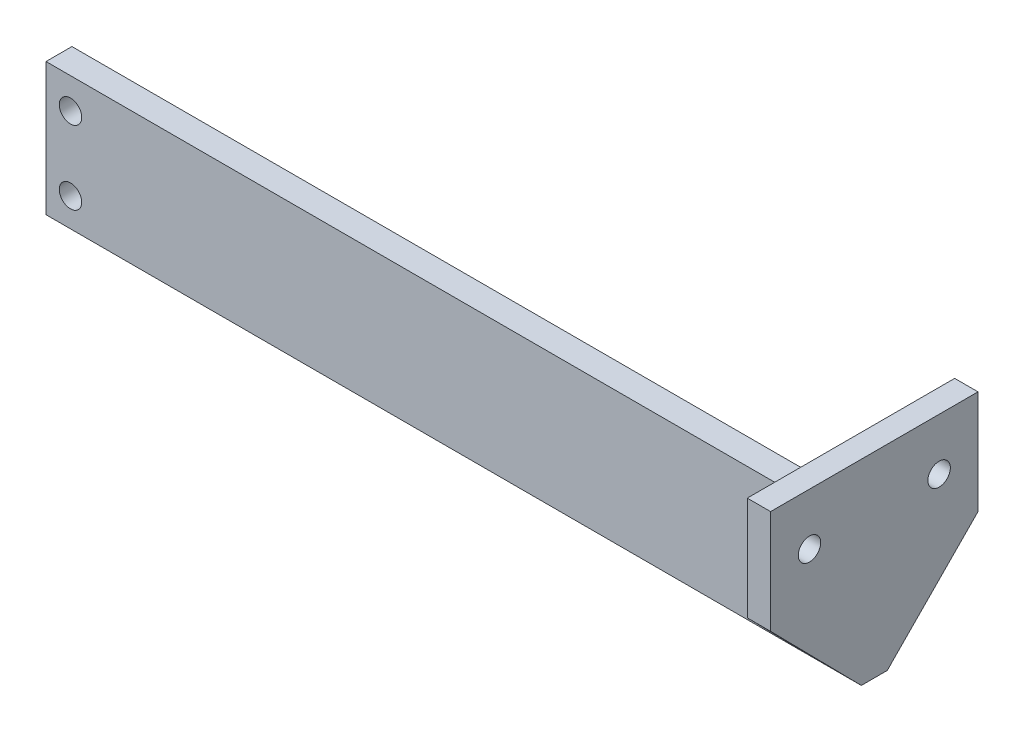
ISO-10303-21;
HEADER;
FILE_DESCRIPTION(('STEP AP214'),'2;1');
FILE_NAME('part.step','',(''),(''),'','','');
FILE_SCHEMA(('AUTOMOTIVE_DESIGN { 1 0 10303 214 1 1 1 1 }'));
ENDSEC;
DATA;
#1=APPLICATION_CONTEXT('core data for automotive mechanical design processes');
#2=APPLICATION_PROTOCOL_DEFINITION('international standard','automotive_design',2000,#1);
#3=PRODUCT_CONTEXT('',#1,'mechanical');
#4=PRODUCT('Part','Part','',(#3));
#5=PRODUCT_RELATED_PRODUCT_CATEGORY('part','',(#4));
#6=PRODUCT_DEFINITION_FORMATION('','',#4);
#7=PRODUCT_DEFINITION_CONTEXT('part definition',#1,'design');
#8=PRODUCT_DEFINITION('design','',#6,#7);
#9=PRODUCT_DEFINITION_SHAPE('','',#8);
#10=(LENGTH_UNIT() NAMED_UNIT(*) SI_UNIT(.MILLI.,.METRE.));
#11=(NAMED_UNIT(*) PLANE_ANGLE_UNIT() SI_UNIT($,.RADIAN.));
#12=(NAMED_UNIT(*) SI_UNIT($,.STERADIAN.) SOLID_ANGLE_UNIT());
#13=UNCERTAINTY_MEASURE_WITH_UNIT(LENGTH_MEASURE(1.E-05),#10,'distance_accuracy_value','');
#14=(GEOMETRIC_REPRESENTATION_CONTEXT(3) GLOBAL_UNCERTAINTY_ASSIGNED_CONTEXT((#13)) GLOBAL_UNIT_ASSIGNED_CONTEXT((#10,
#11,#12)) REPRESENTATION_CONTEXT('',''));
#15=CARTESIAN_POINT('',(0.,0.,0.));
#16=DIRECTION('',(0.,0.,1.));
#17=DIRECTION('',(1.,0.,0.));
#18=AXIS2_PLACEMENT_3D('',#15,#16,#17);
#19=CARTESIAN_POINT('',(0.,0.,6.35));
#20=DIRECTION('',(1.,0.,0.));
#21=DIRECTION('',(0.,0.,-1.));
#22=AXIS2_PLACEMENT_3D('',#19,#20,#21);
#23=PLANE('',#22);
#24=DIRECTION('',(0.,-1.,0.));
#25=VECTOR('',#24,1.);
#26=CARTESIAN_POINT('',(0.,0.,0.));
#27=LINE('',#26,#25);
#28=CARTESIAN_POINT('',(0.,32.5,0.));
#29=VERTEX_POINT('',#28);
#30=CARTESIAN_POINT('',(0.,0.,0.));
#31=VERTEX_POINT('',#30);
#32=EDGE_CURVE('E114',#29,#31,#27,.T.);
#33=ORIENTED_EDGE('',*,*,#32,.T.);
#34=DIRECTION('',(0.,0.,-1.));
#35=VECTOR('',#34,1.);
#36=CARTESIAN_POINT('',(0.,0.,6.35));
#37=LINE('',#36,#35);
#38=CARTESIAN_POINT('',(0.,0.,6.35));
#39=VERTEX_POINT('',#38);
#40=EDGE_CURVE('E11',#39,#31,#37,.T.);
#41=ORIENTED_EDGE('',*,*,#40,.F.);
#42=DIRECTION('',(0.,-1.,0.));
#43=VECTOR('',#42,1.);
#44=CARTESIAN_POINT('',(0.,0.,6.35));
#45=LINE('',#44,#43);
#46=CARTESIAN_POINT('',(0.,32.5,6.35));
#47=VERTEX_POINT('',#46);
#48=EDGE_CURVE('E105',#47,#39,#45,.T.);
#49=ORIENTED_EDGE('',*,*,#48,.F.);
#50=DIRECTION('',(0.,0.,-1.));
#51=VECTOR('',#50,1.);
#52=CARTESIAN_POINT('',(0.,32.5,6.35));
#53=LINE('',#52,#51);
#54=EDGE_CURVE('E115',#47,#29,#53,.T.);
#55=ORIENTED_EDGE('',*,*,#54,.T.);
#56=EDGE_LOOP('',(#33,#41,#49,#55));
#57=FACE_BOUND('',#56,.T.);
#58=ADVANCED_FACE('F46',(#57),#23,.F.);
#59=CARTESIAN_POINT('',(0.,0.,6.35));
#60=DIRECTION('',(0.,1.,0.));
#61=DIRECTION('',(0.,0.,1.));
#62=AXIS2_PLACEMENT_3D('',#59,#60,#61);
#63=PLANE('',#62);
#64=DIRECTION('',(1.,0.,0.));
#65=VECTOR('',#64,1.);
#66=CARTESIAN_POINT('',(0.,0.,0.));
#67=LINE('',#66,#65);
#68=CARTESIAN_POINT('',(193.9764,0.,0.));
#69=VERTEX_POINT('',#68);
#70=EDGE_CURVE('E76',#31,#69,#67,.T.);
#71=ORIENTED_EDGE('',*,*,#70,.T.);
#72=DIRECTION('',(-1.,0.,0.));
#73=VECTOR('',#72,1.);
#74=CARTESIAN_POINT('',(199.6914,0.,0.));
#75=LINE('',#74,#73);
#76=CARTESIAN_POINT('',(199.6914,0.,0.));
#77=VERTEX_POINT('',#76);
#78=EDGE_CURVE('E145',#77,#69,#75,.T.);
#79=ORIENTED_EDGE('',*,*,#78,.F.);
#80=DIRECTION('',(0.,0.,-1.));
#81=VECTOR('',#80,1.);
#82=CARTESIAN_POINT('',(199.6914,0.,0.));
#83=LINE('',#82,#81);
#84=CARTESIAN_POINT('',(199.6914,0.,6.35));
#85=VERTEX_POINT('',#84);
#86=EDGE_CURVE('E211',#85,#77,#83,.T.);
#87=ORIENTED_EDGE('',*,*,#86,.F.);
#88=DIRECTION('',(-1.,0.,0.));
#89=VECTOR('',#88,1.);
#90=CARTESIAN_POINT('',(199.6914,0.,6.35));
#91=LINE('',#90,#89);
#92=CARTESIAN_POINT('',(193.9764,0.,6.35));
#93=VERTEX_POINT('',#92);
#94=EDGE_CURVE('E102',#85,#93,#91,.T.);
#95=ORIENTED_EDGE('',*,*,#94,.T.);
#96=DIRECTION('',(1.,0.,0.));
#97=VECTOR('',#96,1.);
#98=CARTESIAN_POINT('',(0.,0.,6.35));
#99=LINE('',#98,#97);
#100=EDGE_CURVE('E95',#39,#93,#99,.T.);
#101=ORIENTED_EDGE('',*,*,#100,.F.);
#102=ORIENTED_EDGE('',*,*,#40,.T.);
#103=EDGE_LOOP('',(#71,#79,#87,#95,#101,#102));
#104=FACE_BOUND('',#103,.T.);
#105=ADVANCED_FACE('F96',(#104),#63,.F.);
#106=CARTESIAN_POINT('',(0.,32.5,6.35));
#107=DIRECTION('',(0.,-1.,0.));
#108=DIRECTION('',(0.,0.,-1.));
#109=AXIS2_PLACEMENT_3D('',#106,#107,#108);
#110=PLANE('',#109);
#111=DIRECTION('',(-1.,0.,0.));
#112=VECTOR('',#111,1.);
#113=CARTESIAN_POINT('',(0.,32.5,0.));
#114=LINE('',#113,#112);
#115=CARTESIAN_POINT('',(193.9764,32.5,0.));
#116=VERTEX_POINT('',#115);
#117=EDGE_CURVE('E112',#116,#29,#114,.T.);
#118=ORIENTED_EDGE('',*,*,#117,.T.);
#119=ORIENTED_EDGE('',*,*,#54,.F.);
#120=DIRECTION('',(-1.,0.,0.));
#121=VECTOR('',#120,1.);
#122=CARTESIAN_POINT('',(0.,32.5,6.35));
#123=LINE('',#122,#121);
#124=CARTESIAN_POINT('',(193.9764,32.5,6.35));
#125=VERTEX_POINT('',#124);
#126=EDGE_CURVE('E63',#125,#47,#123,.T.);
#127=ORIENTED_EDGE('',*,*,#126,.F.);
#128=DIRECTION('',(0.,0.,-1.));
#129=VECTOR('',#128,1.);
#130=CARTESIAN_POINT('',(193.9764,32.5,6.35));
#131=LINE('',#130,#129);
#132=EDGE_CURVE('E55',#125,#116,#131,.T.);
#133=ORIENTED_EDGE('',*,*,#132,.T.);
#134=EDGE_LOOP('',(#118,#119,#127,#133));
#135=FACE_BOUND('',#134,.T.);
#136=ADVANCED_FACE('F136',(#135),#110,.F.);
#137=CARTESIAN_POINT('',(0.,0.,6.35));
#138=DIRECTION('',(0.,0.,-1.));
#139=DIRECTION('',(-1.,0.,0.));
#140=AXIS2_PLACEMENT_3D('',#137,#138,#139);
#141=PLANE('',#140);
#142=CARTESIAN_POINT('',(6.,25.,6.35));
#143=DIRECTION('',(0.,0.,1.));
#144=DIRECTION('',(1.,0.,0.));
#145=AXIS2_PLACEMENT_3D('',#142,#143,#144);
#146=CIRCLE('',#145,2.75);
#147=CARTESIAN_POINT('',(8.75,25.,6.35));
#148=VERTEX_POINT('',#147);
#149=EDGE_CURVE('E124',#148,#148,#146,.T.);
#150=ORIENTED_EDGE('',*,*,#149,.F.);
#151=EDGE_LOOP('',(#150));
#152=FACE_BOUND('',#151,.T.);
#153=CARTESIAN_POINT('',(6.,7.,6.35));
#154=DIRECTION('',(0.,0.,1.));
#155=DIRECTION('',(1.,0.,0.));
#156=AXIS2_PLACEMENT_3D('',#153,#154,#155);
#157=CIRCLE('',#156,2.75);
#158=CARTESIAN_POINT('',(8.75,7.,6.35));
#159=VERTEX_POINT('',#158);
#160=EDGE_CURVE('E245',#159,#159,#157,.T.);
#161=ORIENTED_EDGE('',*,*,#160,.F.);
#162=EDGE_LOOP('',(#161));
#163=FACE_BOUND('',#162,.T.);
#164=ORIENTED_EDGE('',*,*,#48,.T.);
#165=ORIENTED_EDGE('',*,*,#100,.T.);
#166=DIRECTION('',(0.,1.,0.));
#167=VECTOR('',#166,1.);
#168=CARTESIAN_POINT('',(193.9764,0.,6.35));
#169=LINE('',#168,#167);
#170=EDGE_CURVE('E104',#93,#125,#169,.T.);
#171=ORIENTED_EDGE('',*,*,#170,.T.);
#172=ORIENTED_EDGE('',*,*,#126,.T.);
#173=EDGE_LOOP('',(#164,#165,#171,#172));
#174=FACE_BOUND('',#173,.T.);
#175=ADVANCED_FACE('F108',(#152,#163,#174),#141,.F.);
#176=CARTESIAN_POINT('',(0.,0.,0.));
#177=DIRECTION('',(0.,0.,-1.));
#178=DIRECTION('',(-1.,0.,0.));
#179=AXIS2_PLACEMENT_3D('',#176,#177,#178);
#180=PLANE('',#179);
#181=CARTESIAN_POINT('',(6.,25.,0.));
#182=DIRECTION('',(0.,0.,1.));
#183=DIRECTION('',(1.,0.,0.));
#184=AXIS2_PLACEMENT_3D('',#181,#182,#183);
#185=CIRCLE('',#184,2.75);
#186=CARTESIAN_POINT('',(8.75,25.,0.));
#187=VERTEX_POINT('',#186);
#188=EDGE_CURVE('E118',#187,#187,#185,.T.);
#189=ORIENTED_EDGE('',*,*,#188,.T.);
#190=EDGE_LOOP('',(#189));
#191=FACE_BOUND('',#190,.T.);
#192=CARTESIAN_POINT('',(6.,7.,0.));
#193=DIRECTION('',(0.,0.,1.));
#194=DIRECTION('',(1.,0.,0.));
#195=AXIS2_PLACEMENT_3D('',#192,#193,#194);
#196=CIRCLE('',#195,2.75);
#197=CARTESIAN_POINT('',(8.75,7.,0.));
#198=VERTEX_POINT('',#197);
#199=EDGE_CURVE('E240',#198,#198,#196,.T.);
#200=ORIENTED_EDGE('',*,*,#199,.T.);
#201=EDGE_LOOP('',(#200));
#202=FACE_BOUND('',#201,.T.);
#203=ORIENTED_EDGE('',*,*,#32,.F.);
#204=ORIENTED_EDGE('',*,*,#117,.F.);
#205=DIRECTION('',(0.,1.,0.));
#206=VECTOR('',#205,1.);
#207=CARTESIAN_POINT('',(193.9764,0.,0.));
#208=LINE('',#207,#206);
#209=EDGE_CURVE('E83',#69,#116,#208,.T.);
#210=ORIENTED_EDGE('',*,*,#209,.F.);
#211=ORIENTED_EDGE('',*,*,#70,.F.);
#212=EDGE_LOOP('',(#203,#204,#210,#211));
#213=FACE_BOUND('',#212,.T.);
#214=ADVANCED_FACE('F138',(#191,#202,#213),#180,.T.);
#215=CARTESIAN_POINT('',(6.,7.,0.));
#216=DIRECTION('',(0.,0.,1.));
#217=DIRECTION('',(1.,0.,0.));
#218=AXIS2_PLACEMENT_3D('',#215,#216,#217);
#219=CYLINDRICAL_SURFACE('',#218,2.75);
#220=ORIENTED_EDGE('',*,*,#199,.F.);
#221=EDGE_LOOP('',(#220));
#222=FACE_BOUND('',#221,.T.);
#223=ORIENTED_EDGE('',*,*,#160,.T.);
#224=EDGE_LOOP('',(#223));
#225=FACE_BOUND('',#224,.T.);
#226=ADVANCED_FACE('F256',(#222,#225),#219,.F.);
#227=CARTESIAN_POINT('',(6.,25.,0.));
#228=DIRECTION('',(0.,0.,1.));
#229=DIRECTION('',(1.,0.,0.));
#230=AXIS2_PLACEMENT_3D('',#227,#228,#229);
#231=CYLINDRICAL_SURFACE('',#230,2.75);
#232=ORIENTED_EDGE('',*,*,#188,.F.);
#233=EDGE_LOOP('',(#232));
#234=FACE_BOUND('',#233,.T.);
#235=ORIENTED_EDGE('',*,*,#149,.T.);
#236=EDGE_LOOP('',(#235));
#237=FACE_BOUND('',#236,.T.);
#238=ADVANCED_FACE('F259',(#234,#237),#231,.F.);
#239=CARTESIAN_POINT('',(193.9764,0.,0.));
#240=DIRECTION('',(1.,0.,0.));
#241=DIRECTION('',(0.,0.,-1.));
#242=AXIS2_PLACEMENT_3D('',#239,#240,#241);
#243=PLANE('',#242);
#244=CARTESIAN_POINT('',(193.9764,35.294,19.05));
#245=DIRECTION('',(1.,0.,0.));
#246=DIRECTION('',(0.,0.,-1.));
#247=AXIS2_PLACEMENT_3D('',#244,#245,#246);
#248=CIRCLE('',#247,2.75);
#249=CARTESIAN_POINT('',(193.9764,35.294,16.3));
#250=VERTEX_POINT('',#249);
#251=EDGE_CURVE('E217',#250,#250,#248,.T.);
#252=ORIENTED_EDGE('',*,*,#251,.T.);
#253=EDGE_LOOP('',(#252));
#254=FACE_BOUND('',#253,.T.);
#255=CARTESIAN_POINT('',(193.9764,35.294,-12.7));
#256=DIRECTION('',(1.,0.,0.));
#257=DIRECTION('',(0.,0.,-1.));
#258=AXIS2_PLACEMENT_3D('',#255,#256,#257);
#259=CIRCLE('',#258,2.75);
#260=CARTESIAN_POINT('',(193.9764,35.294,-15.45));
#261=VERTEX_POINT('',#260);
#262=EDGE_CURVE('E447',#261,#261,#259,.T.);
#263=ORIENTED_EDGE('',*,*,#262,.T.);
#264=EDGE_LOOP('',(#263));
#265=FACE_BOUND('',#264,.T.);
#266=DIRECTION('',(0.,-0.712904311519134,0.701261322630466));
#267=VECTOR('',#266,1.);
#268=CARTESIAN_POINT('',(193.9764,0.,0.));
#269=LINE('',#268,#267);
#270=CARTESIAN_POINT('',(193.9764,22.594,-22.225));
#271=VERTEX_POINT('',#270);
#272=EDGE_CURVE('E214',#271,#69,#269,.T.);
#273=ORIENTED_EDGE('',*,*,#272,.T.);
#274=ORIENTED_EDGE('',*,*,#209,.T.);
#275=ORIENTED_EDGE('',*,*,#132,.F.);
#276=ORIENTED_EDGE('',*,*,#170,.F.);
#277=DIRECTION('',(0.,-0.712904311519134,-0.701261322630466));
#278=VECTOR('',#277,1.);
#279=CARTESIAN_POINT('',(193.9764,-3.17456959957092,3.22727673937932));
#280=LINE('',#279,#278);
#281=CARTESIAN_POINT('',(193.9764,22.594,28.575));
#282=VERTEX_POINT('',#281);
#283=EDGE_CURVE('E227',#282,#93,#280,.T.);
#284=ORIENTED_EDGE('',*,*,#283,.F.);
#285=DIRECTION('',(0.,1.,0.));
#286=VECTOR('',#285,1.);
#287=CARTESIAN_POINT('',(193.9764,0.,28.575));
#288=LINE('',#287,#286);
#289=CARTESIAN_POINT('',(193.9764,47.994,28.575));
#290=VERTEX_POINT('',#289);
#291=EDGE_CURVE('E223',#282,#290,#288,.T.);
#292=ORIENTED_EDGE('',*,*,#291,.T.);
#293=DIRECTION('',(0.,0.,-1.));
#294=VECTOR('',#293,1.);
#295=CARTESIAN_POINT('',(193.9764,47.994,0.));
#296=LINE('',#295,#294);
#297=CARTESIAN_POINT('',(193.9764,47.994,-22.225));
#298=VERTEX_POINT('',#297);
#299=EDGE_CURVE('E220',#290,#298,#296,.T.);
#300=ORIENTED_EDGE('',*,*,#299,.T.);
#301=DIRECTION('',(0.,1.,0.));
#302=VECTOR('',#301,1.);
#303=CARTESIAN_POINT('',(193.9764,0.,-22.225));
#304=LINE('',#303,#302);
#305=EDGE_CURVE('E192',#271,#298,#304,.T.);
#306=ORIENTED_EDGE('',*,*,#305,.F.);
#307=EDGE_LOOP('',(#273,#274,#275,#276,#284,#292,#300,#306));
#308=FACE_BOUND('',#307,.T.);
#309=ADVANCED_FACE('F317',(#254,#265,#308),#243,.F.);
#310=CARTESIAN_POINT('',(199.6914,0.,0.));
#311=DIRECTION('',(0.,-0.701261322630466,-0.712904311519134));
#312=DIRECTION('',(0.,0.712904311519134,-0.701261322630466));
#313=AXIS2_PLACEMENT_3D('',#310,#311,#312);
#314=PLANE('',#313);
#315=ORIENTED_EDGE('',*,*,#272,.F.);
#316=DIRECTION('',(-1.,0.,0.));
#317=VECTOR('',#316,1.);
#318=CARTESIAN_POINT('',(199.6914,22.594,-22.225));
#319=LINE('',#318,#317);
#320=CARTESIAN_POINT('',(199.6914,22.594,-22.225));
#321=VERTEX_POINT('',#320);
#322=EDGE_CURVE('E197',#321,#271,#319,.T.);
#323=ORIENTED_EDGE('',*,*,#322,.F.);
#324=DIRECTION('',(0.,-0.712904311519134,0.701261322630466));
#325=VECTOR('',#324,1.);
#326=CARTESIAN_POINT('',(199.6914,0.,0.));
#327=LINE('',#326,#325);
#328=EDGE_CURVE('E184',#321,#77,#327,.T.);
#329=ORIENTED_EDGE('',*,*,#328,.T.);
#330=ORIENTED_EDGE('',*,*,#78,.T.);
#331=EDGE_LOOP('',(#315,#323,#329,#330));
#332=FACE_BOUND('',#331,.T.);
#333=ADVANCED_FACE('F327',(#332),#314,.T.);
#334=CARTESIAN_POINT('',(199.6914,0.,-22.225));
#335=DIRECTION('',(0.,0.,1.));
#336=DIRECTION('',(1.,0.,0.));
#337=AXIS2_PLACEMENT_3D('',#334,#335,#336);
#338=PLANE('',#337);
#339=ORIENTED_EDGE('',*,*,#305,.T.);
#340=DIRECTION('',(-1.,0.,0.));
#341=VECTOR('',#340,1.);
#342=CARTESIAN_POINT('',(199.6914,47.994,-22.225));
#343=LINE('',#342,#341);
#344=CARTESIAN_POINT('',(199.6914,47.994,-22.225));
#345=VERTEX_POINT('',#344);
#346=EDGE_CURVE('E189',#345,#298,#343,.T.);
#347=ORIENTED_EDGE('',*,*,#346,.F.);
#348=DIRECTION('',(0.,1.,0.));
#349=VECTOR('',#348,1.);
#350=CARTESIAN_POINT('',(199.6914,0.,-22.225));
#351=LINE('',#350,#349);
#352=EDGE_CURVE('E177',#321,#345,#351,.T.);
#353=ORIENTED_EDGE('',*,*,#352,.F.);
#354=ORIENTED_EDGE('',*,*,#322,.T.);
#355=EDGE_LOOP('',(#339,#347,#353,#354));
#356=FACE_BOUND('',#355,.T.);
#357=ADVANCED_FACE('F190',(#356),#338,.F.);
#358=CARTESIAN_POINT('',(199.6914,47.994,0.));
#359=DIRECTION('',(0.,1.,0.));
#360=DIRECTION('',(0.,0.,1.));
#361=AXIS2_PLACEMENT_3D('',#358,#359,#360);
#362=PLANE('',#361);
#363=ORIENTED_EDGE('',*,*,#299,.F.);
#364=DIRECTION('',(-1.,0.,0.));
#365=VECTOR('',#364,1.);
#366=CARTESIAN_POINT('',(199.6914,47.994,28.575));
#367=LINE('',#366,#365);
#368=CARTESIAN_POINT('',(199.6914,47.994,28.575));
#369=VERTEX_POINT('',#368);
#370=EDGE_CURVE('E198',#369,#290,#367,.T.);
#371=ORIENTED_EDGE('',*,*,#370,.F.);
#372=DIRECTION('',(0.,0.,-1.));
#373=VECTOR('',#372,1.);
#374=CARTESIAN_POINT('',(199.6914,47.994,0.));
#375=LINE('',#374,#373);
#376=EDGE_CURVE('E182',#369,#345,#375,.T.);
#377=ORIENTED_EDGE('',*,*,#376,.T.);
#378=ORIENTED_EDGE('',*,*,#346,.T.);
#379=EDGE_LOOP('',(#363,#371,#377,#378));
#380=FACE_BOUND('',#379,.T.);
#381=ADVANCED_FACE('F200',(#380),#362,.T.);
#382=CARTESIAN_POINT('',(199.6914,0.,28.575));
#383=DIRECTION('',(0.,0.,1.));
#384=DIRECTION('',(1.,0.,0.));
#385=AXIS2_PLACEMENT_3D('',#382,#383,#384);
#386=PLANE('',#385);
#387=ORIENTED_EDGE('',*,*,#291,.F.);
#388=DIRECTION('',(-1.,0.,0.));
#389=VECTOR('',#388,1.);
#390=CARTESIAN_POINT('',(199.6914,22.594,28.575));
#391=LINE('',#390,#389);
#392=CARTESIAN_POINT('',(199.6914,22.594,28.575));
#393=VERTEX_POINT('',#392);
#394=EDGE_CURVE('E234',#393,#282,#391,.T.);
#395=ORIENTED_EDGE('',*,*,#394,.F.);
#396=DIRECTION('',(0.,1.,0.));
#397=VECTOR('',#396,1.);
#398=CARTESIAN_POINT('',(199.6914,0.,28.575));
#399=LINE('',#398,#397);
#400=EDGE_CURVE('E202',#393,#369,#399,.T.);
#401=ORIENTED_EDGE('',*,*,#400,.T.);
#402=ORIENTED_EDGE('',*,*,#370,.T.);
#403=EDGE_LOOP('',(#387,#395,#401,#402));
#404=FACE_BOUND('',#403,.T.);
#405=ADVANCED_FACE('F352',(#404),#386,.T.);
#406=CARTESIAN_POINT('',(199.6914,-3.17456959957092,3.22727673937932));
#407=DIRECTION('',(0.,0.701261322630466,-0.712904311519134));
#408=DIRECTION('',(0.,0.712904311519134,0.701261322630466));
#409=AXIS2_PLACEMENT_3D('',#406,#407,#408);
#410=PLANE('',#409);
#411=ORIENTED_EDGE('',*,*,#283,.T.);
#412=ORIENTED_EDGE('',*,*,#94,.F.);
#413=DIRECTION('',(0.,-0.712904311519134,-0.701261322630466));
#414=VECTOR('',#413,1.);
#415=CARTESIAN_POINT('',(199.6914,-3.17456959957092,3.22727673937932));
#416=LINE('',#415,#414);
#417=EDGE_CURVE('E205',#393,#85,#416,.T.);
#418=ORIENTED_EDGE('',*,*,#417,.F.);
#419=ORIENTED_EDGE('',*,*,#394,.T.);
#420=EDGE_LOOP('',(#411,#412,#418,#419));
#421=FACE_BOUND('',#420,.T.);
#422=ADVANCED_FACE('F360',(#421),#410,.F.);
#423=CARTESIAN_POINT('',(199.6914,0.,0.));
#424=DIRECTION('',(1.,0.,0.));
#425=DIRECTION('',(0.,0.,-1.));
#426=AXIS2_PLACEMENT_3D('',#423,#424,#425);
#427=PLANE('',#426);
#428=CARTESIAN_POINT('',(199.6914,35.294,19.05));
#429=DIRECTION('',(1.,0.,0.));
#430=DIRECTION('',(0.,0.,-1.));
#431=AXIS2_PLACEMENT_3D('',#428,#429,#430);
#432=CIRCLE('',#431,2.75);
#433=CARTESIAN_POINT('',(199.6914,35.294,16.3));
#434=VERTEX_POINT('',#433);
#435=EDGE_CURVE('E443',#434,#434,#432,.T.);
#436=ORIENTED_EDGE('',*,*,#435,.F.);
#437=EDGE_LOOP('',(#436));
#438=FACE_BOUND('',#437,.T.);
#439=CARTESIAN_POINT('',(199.6914,35.294,-12.7));
#440=DIRECTION('',(1.,0.,0.));
#441=DIRECTION('',(0.,0.,-1.));
#442=AXIS2_PLACEMENT_3D('',#439,#440,#441);
#443=CIRCLE('',#442,2.75);
#444=CARTESIAN_POINT('',(199.6914,35.294,-15.45));
#445=VERTEX_POINT('',#444);
#446=EDGE_CURVE('E456',#445,#445,#443,.T.);
#447=ORIENTED_EDGE('',*,*,#446,.F.);
#448=EDGE_LOOP('',(#447));
#449=FACE_BOUND('',#448,.T.);
#450=ORIENTED_EDGE('',*,*,#328,.F.);
#451=ORIENTED_EDGE('',*,*,#352,.T.);
#452=ORIENTED_EDGE('',*,*,#376,.F.);
#453=ORIENTED_EDGE('',*,*,#400,.F.);
#454=ORIENTED_EDGE('',*,*,#417,.T.);
#455=ORIENTED_EDGE('',*,*,#86,.T.);
#456=EDGE_LOOP('',(#450,#451,#452,#453,#454,#455));
#457=FACE_BOUND('',#456,.T.);
#458=ADVANCED_FACE('F179',(#438,#449,#457),#427,.T.);
#459=CARTESIAN_POINT('',(0.,35.294,-12.7));
#460=DIRECTION('',(1.,0.,0.));
#461=DIRECTION('',(0.,0.,-1.));
#462=AXIS2_PLACEMENT_3D('',#459,#460,#461);
#463=CYLINDRICAL_SURFACE('',#462,2.75);
#464=CARTESIAN_POINT('',(199.6914,35.294,-15.45));
#465=CARTESIAN_POINT('',(199.63186875,35.294,-15.45));
#466=CARTESIAN_POINT('',(199.5723375,35.294,-15.45));
#467=CARTESIAN_POINT('',(199.453275,35.294,-15.45));
#468=CARTESIAN_POINT('',(199.39374375,35.294,-15.45));
#469=CARTESIAN_POINT('',(199.27468125,35.294,-15.45));
#470=CARTESIAN_POINT('',(199.21515,35.294,-15.45));
#471=CARTESIAN_POINT('',(199.0960875,35.294,-15.45));
#472=CARTESIAN_POINT('',(199.03655625,35.294,-15.45));
#473=CARTESIAN_POINT('',(198.91749375,35.294,-15.45));
#474=CARTESIAN_POINT('',(198.8579625,35.294,-15.45));
#475=CARTESIAN_POINT('',(198.7389,35.294,-15.45));
#476=CARTESIAN_POINT('',(198.67936875,35.294,-15.45));
#477=CARTESIAN_POINT('',(198.56030625,35.294,-15.45));
#478=CARTESIAN_POINT('',(198.500775,35.294,-15.45));
#479=CARTESIAN_POINT('',(198.3817125,35.294,-15.45));
#480=CARTESIAN_POINT('',(198.32218125,35.294,-15.45));
#481=CARTESIAN_POINT('',(198.20311875,35.294,-15.45));
#482=CARTESIAN_POINT('',(198.1435875,35.294,-15.45));
#483=CARTESIAN_POINT('',(198.024525,35.294,-15.45));
#484=CARTESIAN_POINT('',(197.96499375,35.294,-15.45));
#485=CARTESIAN_POINT('',(197.84593125,35.294,-15.45));
#486=CARTESIAN_POINT('',(197.7864,35.294,-15.45));
#487=CARTESIAN_POINT('',(197.6673375,35.294,-15.45));
#488=CARTESIAN_POINT('',(197.60780625,35.294,-15.45));
#489=CARTESIAN_POINT('',(197.48874375,35.294,-15.45));
#490=CARTESIAN_POINT('',(197.4292125,35.294,-15.45));
#491=CARTESIAN_POINT('',(197.31015,35.294,-15.45));
#492=CARTESIAN_POINT('',(197.25061875,35.294,-15.45));
#493=CARTESIAN_POINT('',(197.13155625,35.294,-15.45));
#494=CARTESIAN_POINT('',(197.072025,35.294,-15.45));
#495=CARTESIAN_POINT('',(196.9529625,35.294,-15.45));
#496=CARTESIAN_POINT('',(196.89343125,35.294,-15.45));
#497=CARTESIAN_POINT('',(196.77436875,35.294,-15.45));
#498=CARTESIAN_POINT('',(196.7148375,35.294,-15.45));
#499=CARTESIAN_POINT('',(196.595775,35.294,-15.45));
#500=CARTESIAN_POINT('',(196.53624375,35.294,-15.45));
#501=CARTESIAN_POINT('',(196.41718125,35.294,-15.45));
#502=CARTESIAN_POINT('',(196.35765,35.294,-15.45));
#503=CARTESIAN_POINT('',(196.2385875,35.294,-15.45));
#504=CARTESIAN_POINT('',(196.17905625,35.294,-15.45));
#505=CARTESIAN_POINT('',(196.05999375,35.294,-15.45));
#506=CARTESIAN_POINT('',(196.0004625,35.294,-15.45));
#507=CARTESIAN_POINT('',(195.8814,35.294,-15.45));
#508=CARTESIAN_POINT('',(195.82186875,35.294,-15.45));
#509=CARTESIAN_POINT('',(195.70280625,35.294,-15.45));
#510=CARTESIAN_POINT('',(195.643275,35.294,-15.45));
#511=CARTESIAN_POINT('',(195.5242125,35.294,-15.45));
#512=CARTESIAN_POINT('',(195.46468125,35.294,-15.45));
#513=CARTESIAN_POINT('',(195.34561875,35.294,-15.45));
#514=CARTESIAN_POINT('',(195.2860875,35.294,-15.45));
#515=CARTESIAN_POINT('',(195.167025,35.294,-15.45));
#516=CARTESIAN_POINT('',(195.10749375,35.294,-15.45));
#517=CARTESIAN_POINT('',(194.98843125,35.294,-15.45));
#518=CARTESIAN_POINT('',(194.9289,35.294,-15.45));
#519=CARTESIAN_POINT('',(194.8098375,35.294,-15.45));
#520=CARTESIAN_POINT('',(194.75030625,35.294,-15.45));
#521=CARTESIAN_POINT('',(194.63124375,35.294,-15.45));
#522=CARTESIAN_POINT('',(194.5717125,35.294,-15.45));
#523=CARTESIAN_POINT('',(194.45265,35.294,-15.45));
#524=CARTESIAN_POINT('',(194.39311875,35.294,-15.45));
#525=CARTESIAN_POINT('',(194.27405625,35.294,-15.45));
#526=CARTESIAN_POINT('',(194.214525,35.294,-15.45));
#527=CARTESIAN_POINT('',(194.0954625,35.294,-15.45));
#528=CARTESIAN_POINT('',(194.03593125,35.294,-15.45));
#529=CARTESIAN_POINT('',(193.9764,35.294,-15.45));
#530=B_SPLINE_CURVE_WITH_KNOTS('',3,(#464,#465,#466,#467,#468,#469,#470,#471,#472,#473,#474,
#475,#476,#477,#478,#479,#480,#481,#482,#483,#484,#485,#486,#487,#488,#489,#490,#491,#492,#493,
#494,#495,#496,#497,#498,#499,#500,#501,#502,#503,#504,#505,#506,#507,#508,#509,#510,#511,#512,
#513,#514,#515,#516,#517,#518,#519,#520,#521,#522,#523,#524,#525,#526,#527,#528,#529),
.UNSPECIFIED.,.F.,.F.,(4,2,2,2,2,2,2,2,2,2,2,2,2,2,2,2,2,2,2,2,2,2,2,2,2,2,2,2,2,2,2,2,4),(0.,
0.178593750000011,0.357187499999995,0.535781250000006,0.714374999999989,0.892968750000001,
1.07156250000001,1.25015625,1.42875000000001,1.60734375000002,1.7859375,1.96453125000001,
2.14312500000002,2.32171875000001,2.50031250000002,2.67890625,2.85750000000001,3.03609375000002,
3.21468750000001,3.39328125000002,3.571875,3.75046875000001,3.92906250000002,4.10765625000001,
4.28625000000002,4.46484375000003,4.64343750000001,4.82203125000003,5.00062500000004,
5.17921875000002,5.35781250000003,5.53640625000001,5.71500000000003),.UNSPECIFIED.);
#531=EDGE_CURVE('BSEAM378',#445,#261,#530,.T.);
#532=ORIENTED_EDGE('',*,*,#446,.T.);
#533=ORIENTED_EDGE('',*,*,#262,.F.);
#534=ORIENTED_EDGE('',*,*,#531,.T.);
#535=ORIENTED_EDGE('',*,*,#531,.F.);
#536=EDGE_LOOP('',(#532,#534,#533,#535));
#537=FACE_BOUND('',#536,.T.);
#538=ADVANCED_FACE('F378',(#537),#463,.F.);
#539=CARTESIAN_POINT('',(0.,35.294,19.05));
#540=DIRECTION('',(1.,0.,0.));
#541=DIRECTION('',(0.,0.,-1.));
#542=AXIS2_PLACEMENT_3D('',#539,#540,#541);
#543=CYLINDRICAL_SURFACE('',#542,2.75);
#544=CARTESIAN_POINT('',(199.6914,35.294,16.3));
#545=CARTESIAN_POINT('',(199.63186875,35.294,16.3));
#546=CARTESIAN_POINT('',(199.5723375,35.294,16.3));
#547=CARTESIAN_POINT('',(199.453275,35.294,16.3));
#548=CARTESIAN_POINT('',(199.39374375,35.294,16.3));
#549=CARTESIAN_POINT('',(199.27468125,35.294,16.3));
#550=CARTESIAN_POINT('',(199.21515,35.294,16.3));
#551=CARTESIAN_POINT('',(199.0960875,35.294,16.3));
#552=CARTESIAN_POINT('',(199.03655625,35.294,16.3));
#553=CARTESIAN_POINT('',(198.91749375,35.294,16.3));
#554=CARTESIAN_POINT('',(198.8579625,35.294,16.3));
#555=CARTESIAN_POINT('',(198.7389,35.294,16.3));
#556=CARTESIAN_POINT('',(198.67936875,35.294,16.3));
#557=CARTESIAN_POINT('',(198.56030625,35.294,16.3));
#558=CARTESIAN_POINT('',(198.500775,35.294,16.3));
#559=CARTESIAN_POINT('',(198.3817125,35.294,16.3));
#560=CARTESIAN_POINT('',(198.32218125,35.294,16.3));
#561=CARTESIAN_POINT('',(198.20311875,35.294,16.3));
#562=CARTESIAN_POINT('',(198.1435875,35.294,16.3));
#563=CARTESIAN_POINT('',(198.024525,35.294,16.3));
#564=CARTESIAN_POINT('',(197.96499375,35.294,16.3));
#565=CARTESIAN_POINT('',(197.84593125,35.294,16.3));
#566=CARTESIAN_POINT('',(197.7864,35.294,16.3));
#567=CARTESIAN_POINT('',(197.6673375,35.294,16.3));
#568=CARTESIAN_POINT('',(197.60780625,35.294,16.3));
#569=CARTESIAN_POINT('',(197.48874375,35.294,16.3));
#570=CARTESIAN_POINT('',(197.4292125,35.294,16.3));
#571=CARTESIAN_POINT('',(197.31015,35.294,16.3));
#572=CARTESIAN_POINT('',(197.25061875,35.294,16.3));
#573=CARTESIAN_POINT('',(197.13155625,35.294,16.3));
#574=CARTESIAN_POINT('',(197.072025,35.294,16.3));
#575=CARTESIAN_POINT('',(196.9529625,35.294,16.3));
#576=CARTESIAN_POINT('',(196.89343125,35.294,16.3));
#577=CARTESIAN_POINT('',(196.77436875,35.294,16.3));
#578=CARTESIAN_POINT('',(196.7148375,35.294,16.3));
#579=CARTESIAN_POINT('',(196.595775,35.294,16.3));
#580=CARTESIAN_POINT('',(196.53624375,35.294,16.3));
#581=CARTESIAN_POINT('',(196.41718125,35.294,16.3));
#582=CARTESIAN_POINT('',(196.35765,35.294,16.3));
#583=CARTESIAN_POINT('',(196.2385875,35.294,16.3));
#584=CARTESIAN_POINT('',(196.17905625,35.294,16.3));
#585=CARTESIAN_POINT('',(196.05999375,35.294,16.3));
#586=CARTESIAN_POINT('',(196.0004625,35.294,16.3));
#587=CARTESIAN_POINT('',(195.8814,35.294,16.3));
#588=CARTESIAN_POINT('',(195.82186875,35.294,16.3));
#589=CARTESIAN_POINT('',(195.70280625,35.294,16.3));
#590=CARTESIAN_POINT('',(195.643275,35.294,16.3));
#591=CARTESIAN_POINT('',(195.5242125,35.294,16.3));
#592=CARTESIAN_POINT('',(195.46468125,35.294,16.3));
#593=CARTESIAN_POINT('',(195.34561875,35.294,16.3));
#594=CARTESIAN_POINT('',(195.2860875,35.294,16.3));
#595=CARTESIAN_POINT('',(195.167025,35.294,16.3));
#596=CARTESIAN_POINT('',(195.10749375,35.294,16.3));
#597=CARTESIAN_POINT('',(194.98843125,35.294,16.3));
#598=CARTESIAN_POINT('',(194.9289,35.294,16.3));
#599=CARTESIAN_POINT('',(194.8098375,35.294,16.3));
#600=CARTESIAN_POINT('',(194.75030625,35.294,16.3));
#601=CARTESIAN_POINT('',(194.63124375,35.294,16.3));
#602=CARTESIAN_POINT('',(194.5717125,35.294,16.3));
#603=CARTESIAN_POINT('',(194.45265,35.294,16.3));
#604=CARTESIAN_POINT('',(194.39311875,35.294,16.3));
#605=CARTESIAN_POINT('',(194.27405625,35.294,16.3));
#606=CARTESIAN_POINT('',(194.214525,35.294,16.3));
#607=CARTESIAN_POINT('',(194.0954625,35.294,16.3));
#608=CARTESIAN_POINT('',(194.03593125,35.294,16.3));
#609=CARTESIAN_POINT('',(193.9764,35.294,16.3));
#610=B_SPLINE_CURVE_WITH_KNOTS('',3,(#544,#545,#546,#547,#548,#549,#550,#551,#552,#553,#554,
#555,#556,#557,#558,#559,#560,#561,#562,#563,#564,#565,#566,#567,#568,#569,#570,#571,#572,#573,
#574,#575,#576,#577,#578,#579,#580,#581,#582,#583,#584,#585,#586,#587,#588,#589,#590,#591,#592,
#593,#594,#595,#596,#597,#598,#599,#600,#601,#602,#603,#604,#605,#606,#607,#608,#609),
.UNSPECIFIED.,.F.,.F.,(4,2,2,2,2,2,2,2,2,2,2,2,2,2,2,2,2,2,2,2,2,2,2,2,2,2,2,2,2,2,2,2,4),(0.,
0.178593750000011,0.357187499999995,0.535781250000006,0.714374999999989,0.892968750000001,
1.07156250000001,1.25015625,1.42875000000001,1.60734375000002,1.7859375,1.96453125000001,
2.14312500000002,2.32171875000001,2.50031250000002,2.67890625,2.85750000000001,3.03609375000002,
3.21468750000001,3.39328125000002,3.571875,3.75046875000001,3.92906250000002,4.10765625000001,
4.28625000000002,4.46484375000003,4.64343750000001,4.82203125000003,5.00062500000004,
5.17921875000002,5.35781250000003,5.53640625000001,5.71500000000003),.UNSPECIFIED.);
#611=EDGE_CURVE('BSEAM388',#434,#250,#610,.T.);
#612=ORIENTED_EDGE('',*,*,#435,.T.);
#613=ORIENTED_EDGE('',*,*,#251,.F.);
#614=ORIENTED_EDGE('',*,*,#611,.T.);
#615=ORIENTED_EDGE('',*,*,#611,.F.);
#616=EDGE_LOOP('',(#612,#614,#613,#615));
#617=FACE_BOUND('',#616,.T.);
#618=ADVANCED_FACE('F388',(#617),#543,.F.);
#619=CLOSED_SHELL('',(#58,#105,#136,#175,#214,#226,#238,#309,#333,#357,#381,#405,#422,#458,#538,#618));
#620=MANIFOLD_SOLID_BREP('B2',#619);
#621=ADVANCED_BREP_SHAPE_REPRESENTATION('',(#18,#620),#14);
#622=SHAPE_DEFINITION_REPRESENTATION(#9,#621);
ENDSEC;
END-ISO-10303-21;
